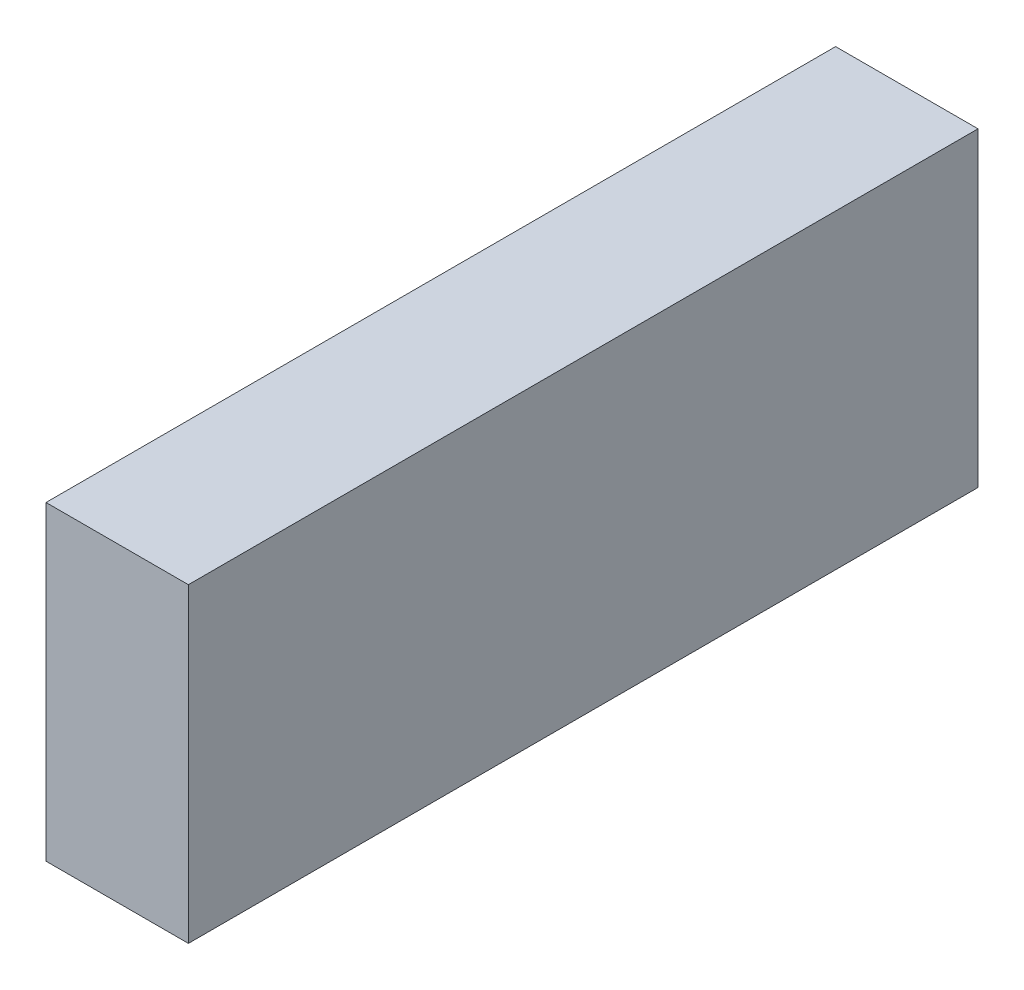
ISO-10303-21;
HEADER;
FILE_DESCRIPTION(('STEP AP214'),'2;1');
FILE_NAME('part.step','',(''),(''),'','','');
FILE_SCHEMA(('AUTOMOTIVE_DESIGN { 1 0 10303 214 1 1 1 1 }'));
ENDSEC;
DATA;
#1=APPLICATION_CONTEXT('core data for automotive mechanical design processes');
#2=APPLICATION_PROTOCOL_DEFINITION('international standard','automotive_design',2000,#1);
#3=PRODUCT_CONTEXT('',#1,'mechanical');
#4=PRODUCT('Part','Part','',(#3));
#5=PRODUCT_RELATED_PRODUCT_CATEGORY('part','',(#4));
#6=PRODUCT_DEFINITION_FORMATION('','',#4);
#7=PRODUCT_DEFINITION_CONTEXT('part definition',#1,'design');
#8=PRODUCT_DEFINITION('design','',#6,#7);
#9=PRODUCT_DEFINITION_SHAPE('','',#8);
#10=(LENGTH_UNIT() NAMED_UNIT(*) SI_UNIT(.MILLI.,.METRE.));
#11=(NAMED_UNIT(*) PLANE_ANGLE_UNIT() SI_UNIT($,.RADIAN.));
#12=(NAMED_UNIT(*) SI_UNIT($,.STERADIAN.) SOLID_ANGLE_UNIT());
#13=UNCERTAINTY_MEASURE_WITH_UNIT(LENGTH_MEASURE(1.E-05),#10,'distance_accuracy_value','');
#14=(GEOMETRIC_REPRESENTATION_CONTEXT(3) GLOBAL_UNCERTAINTY_ASSIGNED_CONTEXT((#13)) GLOBAL_UNIT_ASSIGNED_CONTEXT((#10,
#11,#12)) REPRESENTATION_CONTEXT('',''));
#15=CARTESIAN_POINT('',(0.,0.,0.));
#16=DIRECTION('',(0.,0.,1.));
#17=DIRECTION('',(1.,0.,0.));
#18=AXIS2_PLACEMENT_3D('',#15,#16,#17);
#19=CARTESIAN_POINT('',(-0.01,-0.01,-122.));
#20=DIRECTION('',(0.,0.,-1.));
#21=DIRECTION('',(0.,1.,0.));
#22=AXIS2_PLACEMENT_3D('',#19,#20,#21);
#23=PLANE('',#22);
#24=DIRECTION('',(0.,1.,0.));
#25=VECTOR('',#24,1.);
#26=CARTESIAN_POINT('',(22.,24.,-122.));
#27=LINE('',#26,#25);
#28=CARTESIAN_POINT('',(22.,0.,-122.));
#29=VERTEX_POINT('',#28);
#30=CARTESIAN_POINT('',(22.,48.,-122.));
#31=VERTEX_POINT('',#30);
#32=EDGE_CURVE('E69',#29,#31,#27,.T.);
#33=ORIENTED_EDGE('',*,*,#32,.F.);
#34=DIRECTION('',(1.,0.,0.));
#35=VECTOR('',#34,1.);
#36=CARTESIAN_POINT('',(11.,0.,-122.));
#37=LINE('',#36,#35);
#38=CARTESIAN_POINT('',(0.,0.,-122.));
#39=VERTEX_POINT('',#38);
#40=EDGE_CURVE('E56',#39,#29,#37,.T.);
#41=ORIENTED_EDGE('',*,*,#40,.F.);
#42=DIRECTION('',(0.,-1.,0.));
#43=VECTOR('',#42,1.);
#44=CARTESIAN_POINT('',(0.,24.,-122.));
#45=LINE('',#44,#43);
#46=CARTESIAN_POINT('',(0.,48.,-122.));
#47=VERTEX_POINT('',#46);
#48=EDGE_CURVE('E21',#47,#39,#45,.T.);
#49=ORIENTED_EDGE('',*,*,#48,.F.);
#50=DIRECTION('',(-1.,0.,0.));
#51=VECTOR('',#50,1.);
#52=CARTESIAN_POINT('',(11.,48.,-122.));
#53=LINE('',#52,#51);
#54=EDGE_CURVE('E82',#31,#47,#53,.T.);
#55=ORIENTED_EDGE('',*,*,#54,.F.);
#56=EDGE_LOOP('',(#33,#41,#49,#55));
#57=FACE_BOUND('',#56,.T.);
#58=ADVANCED_FACE('F17',(#57),#23,.T.);
#59=CARTESIAN_POINT('',(0.,-0.00999999999999891,-122.01));
#60=DIRECTION('',(-1.,0.,0.));
#61=DIRECTION('',(0.,0.,1.));
#62=AXIS2_PLACEMENT_3D('',#59,#60,#61);
#63=PLANE('',#62);
#64=DIRECTION('',(0.,0.,1.));
#65=VECTOR('',#64,1.);
#66=CARTESIAN_POINT('',(0.,48.,-61.));
#67=LINE('',#66,#65);
#68=CARTESIAN_POINT('',(0.,48.,0.));
#69=VERTEX_POINT('',#68);
#70=EDGE_CURVE('E65',#47,#69,#67,.T.);
#71=ORIENTED_EDGE('',*,*,#70,.F.);
#72=ORIENTED_EDGE('',*,*,#48,.T.);
#73=DIRECTION('',(0.,0.,-1.));
#74=VECTOR('',#73,1.);
#75=CARTESIAN_POINT('',(0.,0.,-61.));
#76=LINE('',#75,#74);
#77=CARTESIAN_POINT('',(0.,0.,0.));
#78=VERTEX_POINT('',#77);
#79=EDGE_CURVE('E62',#78,#39,#76,.T.);
#80=ORIENTED_EDGE('',*,*,#79,.F.);
#81=DIRECTION('',(0.,-1.,0.));
#82=VECTOR('',#81,1.);
#83=CARTESIAN_POINT('',(0.,24.,0.));
#84=LINE('',#83,#82);
#85=EDGE_CURVE('E84',#69,#78,#84,.T.);
#86=ORIENTED_EDGE('',*,*,#85,.F.);
#87=EDGE_LOOP('',(#71,#72,#80,#86));
#88=FACE_BOUND('',#87,.T.);
#89=ADVANCED_FACE('F61',(#88),#63,.T.);
#90=CARTESIAN_POINT('',(-0.01,0.,0.01));
#91=DIRECTION('',(0.,-1.,0.));
#92=DIRECTION('',(0.,0.,-1.));
#93=AXIS2_PLACEMENT_3D('',#90,#91,#92);
#94=PLANE('',#93);
#95=DIRECTION('',(0.,0.,-1.));
#96=VECTOR('',#95,1.);
#97=CARTESIAN_POINT('',(22.,0.,-61.));
#98=LINE('',#97,#96);
#99=CARTESIAN_POINT('',(22.,0.,0.));
#100=VERTEX_POINT('',#99);
#101=EDGE_CURVE('E71',#100,#29,#98,.T.);
#102=ORIENTED_EDGE('',*,*,#101,.F.);
#103=DIRECTION('',(1.,0.,0.));
#104=VECTOR('',#103,1.);
#105=CARTESIAN_POINT('',(11.,0.,0.));
#106=LINE('',#105,#104);
#107=EDGE_CURVE('E75',#78,#100,#106,.T.);
#108=ORIENTED_EDGE('',*,*,#107,.F.);
#109=ORIENTED_EDGE('',*,*,#79,.T.);
#110=ORIENTED_EDGE('',*,*,#40,.T.);
#111=EDGE_LOOP('',(#102,#108,#109,#110));
#112=FACE_BOUND('',#111,.T.);
#113=ADVANCED_FACE('F73',(#112),#94,.T.);
#114=CARTESIAN_POINT('',(22.,-0.00999999999999891,0.0100000000000033));
#115=DIRECTION('',(1.,0.,0.));
#116=DIRECTION('',(0.,0.,-1.));
#117=AXIS2_PLACEMENT_3D('',#114,#115,#116);
#118=PLANE('',#117);
#119=DIRECTION('',(0.,0.,-1.));
#120=VECTOR('',#119,1.);
#121=CARTESIAN_POINT('',(22.,48.,-61.));
#122=LINE('',#121,#120);
#123=CARTESIAN_POINT('',(22.,48.,0.));
#124=VERTEX_POINT('',#123);
#125=EDGE_CURVE('E36',#124,#31,#122,.T.);
#126=ORIENTED_EDGE('',*,*,#125,.F.);
#127=DIRECTION('',(0.,1.,0.));
#128=VECTOR('',#127,1.);
#129=CARTESIAN_POINT('',(22.,24.,0.));
#130=LINE('',#129,#128);
#131=EDGE_CURVE('E27',#100,#124,#130,.T.);
#132=ORIENTED_EDGE('',*,*,#131,.F.);
#133=ORIENTED_EDGE('',*,*,#101,.T.);
#134=ORIENTED_EDGE('',*,*,#32,.T.);
#135=EDGE_LOOP('',(#126,#132,#133,#134));
#136=FACE_BOUND('',#135,.T.);
#137=ADVANCED_FACE('F89',(#136),#118,.T.);
#138=CARTESIAN_POINT('',(-0.01,48.,-122.01));
#139=DIRECTION('',(0.,1.,0.));
#140=DIRECTION('',(0.,0.,1.));
#141=AXIS2_PLACEMENT_3D('',#138,#139,#140);
#142=PLANE('',#141);
#143=ORIENTED_EDGE('',*,*,#125,.T.);
#144=ORIENTED_EDGE('',*,*,#54,.T.);
#145=ORIENTED_EDGE('',*,*,#70,.T.);
#146=DIRECTION('',(-1.,0.,0.));
#147=VECTOR('',#146,1.);
#148=CARTESIAN_POINT('',(11.,48.,0.));
#149=LINE('',#148,#147);
#150=EDGE_CURVE('E11',#124,#69,#149,.T.);
#151=ORIENTED_EDGE('',*,*,#150,.F.);
#152=EDGE_LOOP('',(#143,#144,#145,#151));
#153=FACE_BOUND('',#152,.T.);
#154=ADVANCED_FACE('F91',(#153),#142,.T.);
#155=CARTESIAN_POINT('',(-0.01,48.01,0.));
#156=DIRECTION('',(0.,0.,1.));
#157=DIRECTION('',(0.,-1.,0.));
#158=AXIS2_PLACEMENT_3D('',#155,#156,#157);
#159=PLANE('',#158);
#160=ORIENTED_EDGE('',*,*,#131,.T.);
#161=ORIENTED_EDGE('',*,*,#150,.T.);
#162=ORIENTED_EDGE('',*,*,#85,.T.);
#163=ORIENTED_EDGE('',*,*,#107,.T.);
#164=EDGE_LOOP('',(#160,#161,#162,#163));
#165=FACE_BOUND('',#164,.T.);
#166=ADVANCED_FACE('F19',(#165),#159,.T.);
#167=CLOSED_SHELL('',(#58,#89,#113,#137,#154,#166));
#168=MANIFOLD_SOLID_BREP('B1',#167);
#169=ADVANCED_BREP_SHAPE_REPRESENTATION('',(#18,#168),#14);
#170=SHAPE_DEFINITION_REPRESENTATION(#9,#169);
ENDSEC;
END-ISO-10303-21;
